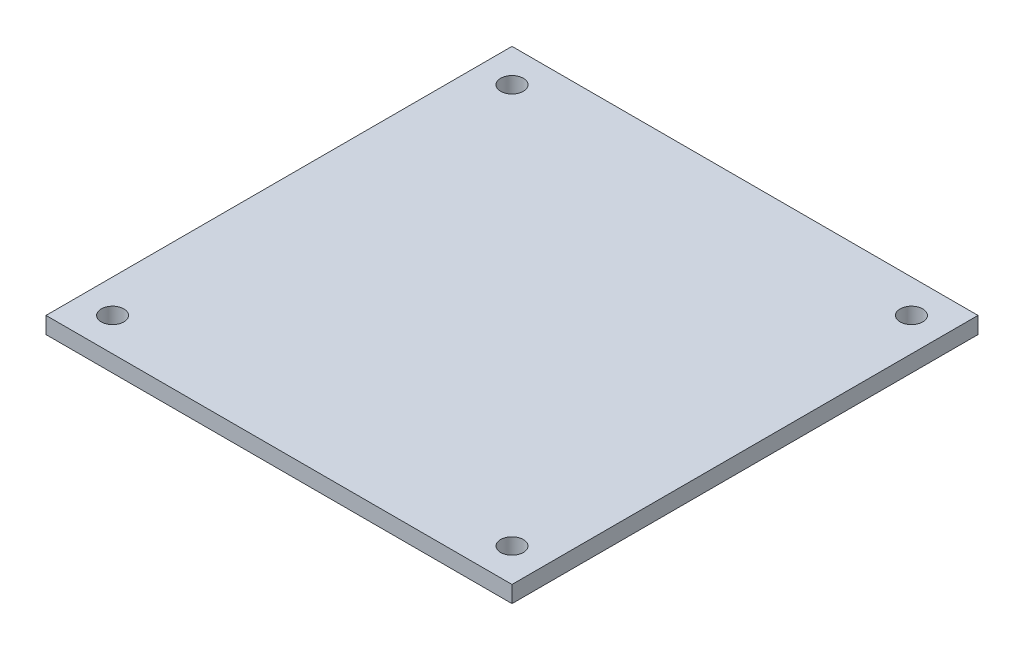
ISO-10303-21;
HEADER;
FILE_DESCRIPTION(('STEP AP214'),'2;1');
FILE_NAME('part.step','',(''),(''),'','','');
FILE_SCHEMA(('AUTOMOTIVE_DESIGN { 1 0 10303 214 1 1 1 1 }'));
ENDSEC;
DATA;
#1=APPLICATION_CONTEXT('core data for automotive mechanical design processes');
#2=APPLICATION_PROTOCOL_DEFINITION('international standard','automotive_design',2000,#1);
#3=PRODUCT_CONTEXT('',#1,'mechanical');
#4=PRODUCT('Part','Part','',(#3));
#5=PRODUCT_RELATED_PRODUCT_CATEGORY('part','',(#4));
#6=PRODUCT_DEFINITION_FORMATION('','',#4);
#7=PRODUCT_DEFINITION_CONTEXT('part definition',#1,'design');
#8=PRODUCT_DEFINITION('design','',#6,#7);
#9=PRODUCT_DEFINITION_SHAPE('','',#8);
#10=(LENGTH_UNIT() NAMED_UNIT(*) SI_UNIT(.MILLI.,.METRE.));
#11=(NAMED_UNIT(*) PLANE_ANGLE_UNIT() SI_UNIT($,.RADIAN.));
#12=(NAMED_UNIT(*) SI_UNIT($,.STERADIAN.) SOLID_ANGLE_UNIT());
#13=UNCERTAINTY_MEASURE_WITH_UNIT(LENGTH_MEASURE(1.E-05),#10,'distance_accuracy_value','');
#14=(GEOMETRIC_REPRESENTATION_CONTEXT(3) GLOBAL_UNCERTAINTY_ASSIGNED_CONTEXT((#13)) GLOBAL_UNIT_ASSIGNED_CONTEXT((#10,
#11,#12)) REPRESENTATION_CONTEXT('',''));
#15=CARTESIAN_POINT('',(0.,0.,0.));
#16=DIRECTION('',(0.,0.,1.));
#17=DIRECTION('',(1.,0.,0.));
#18=AXIS2_PLACEMENT_3D('',#15,#16,#17);
#19=CARTESIAN_POINT('',(0.,2.5,0.));
#20=DIRECTION('',(0.,-1.,0.));
#21=DIRECTION('',(0.,0.,-1.));
#22=AXIS2_PLACEMENT_3D('',#19,#20,#21);
#23=PLANE('',#22);
#24=DIRECTION('',(0.,0.,1.));
#25=VECTOR('',#24,1.);
#26=CARTESIAN_POINT('',(0.,2.5,0.));
#27=LINE('',#26,#25);
#28=CARTESIAN_POINT('',(0.,2.5,-70.));
#29=VERTEX_POINT('',#28);
#30=CARTESIAN_POINT('',(0.,2.5,0.));
#31=VERTEX_POINT('',#30);
#32=EDGE_CURVE('E98',#29,#31,#27,.T.);
#33=ORIENTED_EDGE('',*,*,#32,.T.);
#34=DIRECTION('',(1.,0.,0.));
#35=VECTOR('',#34,1.);
#36=CARTESIAN_POINT('',(0.,2.5,0.));
#37=LINE('',#36,#35);
#38=CARTESIAN_POINT('',(70.,2.5,0.));
#39=VERTEX_POINT('',#38);
#40=EDGE_CURVE('E93',#31,#39,#37,.T.);
#41=ORIENTED_EDGE('',*,*,#40,.T.);
#42=DIRECTION('',(0.,0.,-1.));
#43=VECTOR('',#42,1.);
#44=CARTESIAN_POINT('',(70.,2.5,0.));
#45=LINE('',#44,#43);
#46=CARTESIAN_POINT('',(70.,2.5,-70.));
#47=VERTEX_POINT('',#46);
#48=EDGE_CURVE('E96',#39,#47,#45,.T.);
#49=ORIENTED_EDGE('',*,*,#48,.T.);
#50=DIRECTION('',(-1.,0.,0.));
#51=VECTOR('',#50,1.);
#52=CARTESIAN_POINT('',(0.,2.5,-70.));
#53=LINE('',#52,#51);
#54=EDGE_CURVE('E63',#47,#29,#53,.T.);
#55=ORIENTED_EDGE('',*,*,#54,.T.);
#56=EDGE_LOOP('',(#33,#41,#49,#55));
#57=FACE_BOUND('',#56,.T.);
#58=CARTESIAN_POINT('',(65.,2.5,-65.));
#59=DIRECTION('',(0.,1.,0.));
#60=DIRECTION('',(0.,0.,1.));
#61=AXIS2_PLACEMENT_3D('',#58,#59,#60);
#62=CIRCLE('',#61,1.7);
#63=CARTESIAN_POINT('',(65.,2.5,-63.3));
#64=VERTEX_POINT('',#63);
#65=EDGE_CURVE('E118',#64,#64,#62,.T.);
#66=ORIENTED_EDGE('',*,*,#65,.F.);
#67=EDGE_LOOP('',(#66));
#68=FACE_BOUND('',#67,.T.);
#69=CARTESIAN_POINT('',(5.,2.5,-65.));
#70=DIRECTION('',(0.,1.,0.));
#71=DIRECTION('',(0.,0.,-1.));
#72=AXIS2_PLACEMENT_3D('',#69,#70,#71);
#73=CIRCLE('',#72,1.69999999999999);
#74=CARTESIAN_POINT('',(5.,2.5,-66.7));
#75=VERTEX_POINT('',#74);
#76=EDGE_CURVE('E140',#75,#75,#73,.T.);
#77=ORIENTED_EDGE('',*,*,#76,.F.);
#78=EDGE_LOOP('',(#77));
#79=FACE_BOUND('',#78,.T.);
#80=CARTESIAN_POINT('',(65.,2.5,-5.));
#81=DIRECTION('',(0.,1.,0.));
#82=DIRECTION('',(0.,0.,-1.));
#83=AXIS2_PLACEMENT_3D('',#80,#81,#82);
#84=CIRCLE('',#83,1.7);
#85=CARTESIAN_POINT('',(65.,2.5,-6.7));
#86=VERTEX_POINT('',#85);
#87=EDGE_CURVE('E148',#86,#86,#84,.T.);
#88=ORIENTED_EDGE('',*,*,#87,.F.);
#89=EDGE_LOOP('',(#88));
#90=FACE_BOUND('',#89,.T.);
#91=CARTESIAN_POINT('',(5.,2.5,-5.));
#92=DIRECTION('',(0.,1.,0.));
#93=DIRECTION('',(0.,0.,1.));
#94=AXIS2_PLACEMENT_3D('',#91,#92,#93);
#95=CIRCLE('',#94,1.69999999999999);
#96=CARTESIAN_POINT('',(5.,2.5,-3.30000000000001));
#97=VERTEX_POINT('',#96);
#98=EDGE_CURVE('E156',#97,#97,#95,.T.);
#99=ORIENTED_EDGE('',*,*,#98,.F.);
#100=EDGE_LOOP('',(#99));
#101=FACE_BOUND('',#100,.T.);
#102=ADVANCED_FACE('F45',(#57,#68,#79,#90,#101),#23,.F.);
#103=CARTESIAN_POINT('',(0.,0.,0.));
#104=DIRECTION('',(0.,-1.,0.));
#105=DIRECTION('',(0.,0.,-1.));
#106=AXIS2_PLACEMENT_3D('',#103,#104,#105);
#107=PLANE('',#106);
#108=CARTESIAN_POINT('',(65.,0.,-5.));
#109=DIRECTION('',(0.,1.,0.));
#110=DIRECTION('',(0.,0.,-1.));
#111=AXIS2_PLACEMENT_3D('',#108,#109,#110);
#112=CIRCLE('',#111,1.7);
#113=CARTESIAN_POINT('',(65.,0.,-6.7));
#114=VERTEX_POINT('',#113);
#115=EDGE_CURVE('E152',#114,#114,#112,.T.);
#116=ORIENTED_EDGE('',*,*,#115,.T.);
#117=EDGE_LOOP('',(#116));
#118=FACE_BOUND('',#117,.T.);
#119=CARTESIAN_POINT('',(65.,0.,-65.));
#120=DIRECTION('',(0.,1.,0.));
#121=DIRECTION('',(0.,0.,1.));
#122=AXIS2_PLACEMENT_3D('',#119,#120,#121);
#123=CIRCLE('',#122,1.7);
#124=CARTESIAN_POINT('',(65.,0.,-63.3));
#125=VERTEX_POINT('',#124);
#126=EDGE_CURVE('E136',#125,#125,#123,.T.);
#127=ORIENTED_EDGE('',*,*,#126,.T.);
#128=EDGE_LOOP('',(#127));
#129=FACE_BOUND('',#128,.T.);
#130=DIRECTION('',(0.,0.,1.));
#131=VECTOR('',#130,1.);
#132=CARTESIAN_POINT('',(0.,0.,0.));
#133=LINE('',#132,#131);
#134=CARTESIAN_POINT('',(0.,0.,-70.));
#135=VERTEX_POINT('',#134);
#136=CARTESIAN_POINT('',(0.,0.,0.));
#137=VERTEX_POINT('',#136);
#138=EDGE_CURVE('E114',#135,#137,#133,.T.);
#139=ORIENTED_EDGE('',*,*,#138,.F.);
#140=DIRECTION('',(-1.,0.,0.));
#141=VECTOR('',#140,1.);
#142=CARTESIAN_POINT('',(0.,0.,-70.));
#143=LINE('',#142,#141);
#144=CARTESIAN_POINT('',(70.,0.,-70.));
#145=VERTEX_POINT('',#144);
#146=EDGE_CURVE('E86',#145,#135,#143,.T.);
#147=ORIENTED_EDGE('',*,*,#146,.F.);
#148=DIRECTION('',(0.,0.,-1.));
#149=VECTOR('',#148,1.);
#150=CARTESIAN_POINT('',(70.,0.,0.));
#151=LINE('',#150,#149);
#152=CARTESIAN_POINT('',(70.,0.,0.));
#153=VERTEX_POINT('',#152);
#154=EDGE_CURVE('E80',#153,#145,#151,.T.);
#155=ORIENTED_EDGE('',*,*,#154,.F.);
#156=DIRECTION('',(1.,0.,0.));
#157=VECTOR('',#156,1.);
#158=CARTESIAN_POINT('',(0.,0.,0.));
#159=LINE('',#158,#157);
#160=EDGE_CURVE('E103',#137,#153,#159,.T.);
#161=ORIENTED_EDGE('',*,*,#160,.F.);
#162=EDGE_LOOP('',(#139,#147,#155,#161));
#163=FACE_BOUND('',#162,.T.);
#164=CARTESIAN_POINT('',(5.,0.,-65.));
#165=DIRECTION('',(0.,1.,0.));
#166=DIRECTION('',(0.,0.,-1.));
#167=AXIS2_PLACEMENT_3D('',#164,#165,#166);
#168=CIRCLE('',#167,1.69999999999999);
#169=CARTESIAN_POINT('',(5.,0.,-66.7));
#170=VERTEX_POINT('',#169);
#171=EDGE_CURVE('E144',#170,#170,#168,.T.);
#172=ORIENTED_EDGE('',*,*,#171,.T.);
#173=EDGE_LOOP('',(#172));
#174=FACE_BOUND('',#173,.T.);
#175=CARTESIAN_POINT('',(5.,0.,-5.));
#176=DIRECTION('',(0.,1.,0.));
#177=DIRECTION('',(0.,0.,1.));
#178=AXIS2_PLACEMENT_3D('',#175,#176,#177);
#179=CIRCLE('',#178,1.69999999999999);
#180=CARTESIAN_POINT('',(5.,0.,-3.30000000000001));
#181=VERTEX_POINT('',#180);
#182=EDGE_CURVE('E160',#181,#181,#179,.T.);
#183=ORIENTED_EDGE('',*,*,#182,.T.);
#184=EDGE_LOOP('',(#183));
#185=FACE_BOUND('',#184,.T.);
#186=ADVANCED_FACE('F131',(#118,#129,#163,#174,#185),#107,.T.);
#187=CARTESIAN_POINT('',(0.,2.5,0.));
#188=DIRECTION('',(1.,0.,0.));
#189=DIRECTION('',(0.,0.,-1.));
#190=AXIS2_PLACEMENT_3D('',#187,#188,#189);
#191=PLANE('',#190);
#192=ORIENTED_EDGE('',*,*,#138,.T.);
#193=DIRECTION('',(0.,-1.,0.));
#194=VECTOR('',#193,1.);
#195=CARTESIAN_POINT('',(0.,2.5,0.));
#196=LINE('',#195,#194);
#197=EDGE_CURVE('E11',#31,#137,#196,.T.);
#198=ORIENTED_EDGE('',*,*,#197,.F.);
#199=ORIENTED_EDGE('',*,*,#32,.F.);
#200=DIRECTION('',(0.,-1.,0.));
#201=VECTOR('',#200,1.);
#202=CARTESIAN_POINT('',(0.,2.5,-70.));
#203=LINE('',#202,#201);
#204=EDGE_CURVE('E110',#29,#135,#203,.T.);
#205=ORIENTED_EDGE('',*,*,#204,.T.);
#206=EDGE_LOOP('',(#192,#198,#199,#205));
#207=FACE_BOUND('',#206,.T.);
#208=ADVANCED_FACE('F47',(#207),#191,.F.);
#209=CARTESIAN_POINT('',(0.,2.5,0.));
#210=DIRECTION('',(0.,0.,-1.));
#211=DIRECTION('',(-1.,0.,0.));
#212=AXIS2_PLACEMENT_3D('',#209,#210,#211);
#213=PLANE('',#212);
#214=ORIENTED_EDGE('',*,*,#160,.T.);
#215=DIRECTION('',(0.,-1.,0.));
#216=VECTOR('',#215,1.);
#217=CARTESIAN_POINT('',(70.,2.5,0.));
#218=LINE('',#217,#216);
#219=EDGE_CURVE('E55',#39,#153,#218,.T.);
#220=ORIENTED_EDGE('',*,*,#219,.F.);
#221=ORIENTED_EDGE('',*,*,#40,.F.);
#222=ORIENTED_EDGE('',*,*,#197,.T.);
#223=EDGE_LOOP('',(#214,#220,#221,#222));
#224=FACE_BOUND('',#223,.T.);
#225=ADVANCED_FACE('F102',(#224),#213,.F.);
#226=CARTESIAN_POINT('',(70.,2.5,0.));
#227=DIRECTION('',(-1.,0.,0.));
#228=DIRECTION('',(0.,0.,1.));
#229=AXIS2_PLACEMENT_3D('',#226,#227,#228);
#230=PLANE('',#229);
#231=ORIENTED_EDGE('',*,*,#154,.T.);
#232=DIRECTION('',(0.,-1.,0.));
#233=VECTOR('',#232,1.);
#234=CARTESIAN_POINT('',(70.,2.5,-70.));
#235=LINE('',#234,#233);
#236=EDGE_CURVE('E105',#47,#145,#235,.T.);
#237=ORIENTED_EDGE('',*,*,#236,.F.);
#238=ORIENTED_EDGE('',*,*,#48,.F.);
#239=ORIENTED_EDGE('',*,*,#219,.T.);
#240=EDGE_LOOP('',(#231,#237,#238,#239));
#241=FACE_BOUND('',#240,.T.);
#242=ADVANCED_FACE('F106',(#241),#230,.F.);
#243=CARTESIAN_POINT('',(0.,2.5,-70.));
#244=DIRECTION('',(0.,0.,1.));
#245=DIRECTION('',(1.,0.,0.));
#246=AXIS2_PLACEMENT_3D('',#243,#244,#245);
#247=PLANE('',#246);
#248=ORIENTED_EDGE('',*,*,#146,.T.);
#249=ORIENTED_EDGE('',*,*,#204,.F.);
#250=ORIENTED_EDGE('',*,*,#54,.F.);
#251=ORIENTED_EDGE('',*,*,#236,.T.);
#252=EDGE_LOOP('',(#248,#249,#250,#251));
#253=FACE_BOUND('',#252,.T.);
#254=ADVANCED_FACE('F128',(#253),#247,.F.);
#255=CARTESIAN_POINT('',(65.,2.5,-65.));
#256=DIRECTION('',(0.,-1.,0.));
#257=DIRECTION('',(0.,0.,-1.));
#258=AXIS2_PLACEMENT_3D('',#255,#256,#257);
#259=CYLINDRICAL_SURFACE('',#258,1.7);
#260=ORIENTED_EDGE('',*,*,#65,.T.);
#261=EDGE_LOOP('',(#260));
#262=FACE_BOUND('',#261,.T.);
#263=ORIENTED_EDGE('',*,*,#126,.F.);
#264=EDGE_LOOP('',(#263));
#265=FACE_BOUND('',#264,.T.);
#266=ADVANCED_FACE('F179',(#262,#265),#259,.F.);
#267=CARTESIAN_POINT('',(5.,2.5,-65.));
#268=DIRECTION('',(0.,-1.,0.));
#269=DIRECTION('',(0.,0.,-1.));
#270=AXIS2_PLACEMENT_3D('',#267,#268,#269);
#271=CYLINDRICAL_SURFACE('',#270,1.69999999999999);
#272=ORIENTED_EDGE('',*,*,#76,.T.);
#273=EDGE_LOOP('',(#272));
#274=FACE_BOUND('',#273,.T.);
#275=ORIENTED_EDGE('',*,*,#171,.F.);
#276=EDGE_LOOP('',(#275));
#277=FACE_BOUND('',#276,.T.);
#278=ADVANCED_FACE('F224',(#274,#277),#271,.F.);
#279=CARTESIAN_POINT('',(65.,2.5,-5.));
#280=DIRECTION('',(0.,-1.,0.));
#281=DIRECTION('',(0.,0.,-1.));
#282=AXIS2_PLACEMENT_3D('',#279,#280,#281);
#283=CYLINDRICAL_SURFACE('',#282,1.7);
#284=ORIENTED_EDGE('',*,*,#87,.T.);
#285=EDGE_LOOP('',(#284));
#286=FACE_BOUND('',#285,.T.);
#287=ORIENTED_EDGE('',*,*,#115,.F.);
#288=EDGE_LOOP('',(#287));
#289=FACE_BOUND('',#288,.T.);
#290=ADVANCED_FACE('F232',(#286,#289),#283,.F.);
#291=CARTESIAN_POINT('',(5.,2.5,-5.));
#292=DIRECTION('',(0.,-1.,0.));
#293=DIRECTION('',(0.,0.,-1.));
#294=AXIS2_PLACEMENT_3D('',#291,#292,#293);
#295=CYLINDRICAL_SURFACE('',#294,1.69999999999999);
#296=ORIENTED_EDGE('',*,*,#98,.T.);
#297=EDGE_LOOP('',(#296));
#298=FACE_BOUND('',#297,.T.);
#299=ORIENTED_EDGE('',*,*,#182,.F.);
#300=EDGE_LOOP('',(#299));
#301=FACE_BOUND('',#300,.T.);
#302=ADVANCED_FACE('F168',(#298,#301),#295,.F.);
#303=CLOSED_SHELL('',(#102,#186,#208,#225,#242,#254,#266,#278,#290,#302));
#304=MANIFOLD_SOLID_BREP('B2',#303);
#305=ADVANCED_BREP_SHAPE_REPRESENTATION('',(#18,#304),#14);
#306=SHAPE_DEFINITION_REPRESENTATION(#9,#305);
ENDSEC;
END-ISO-10303-21;
